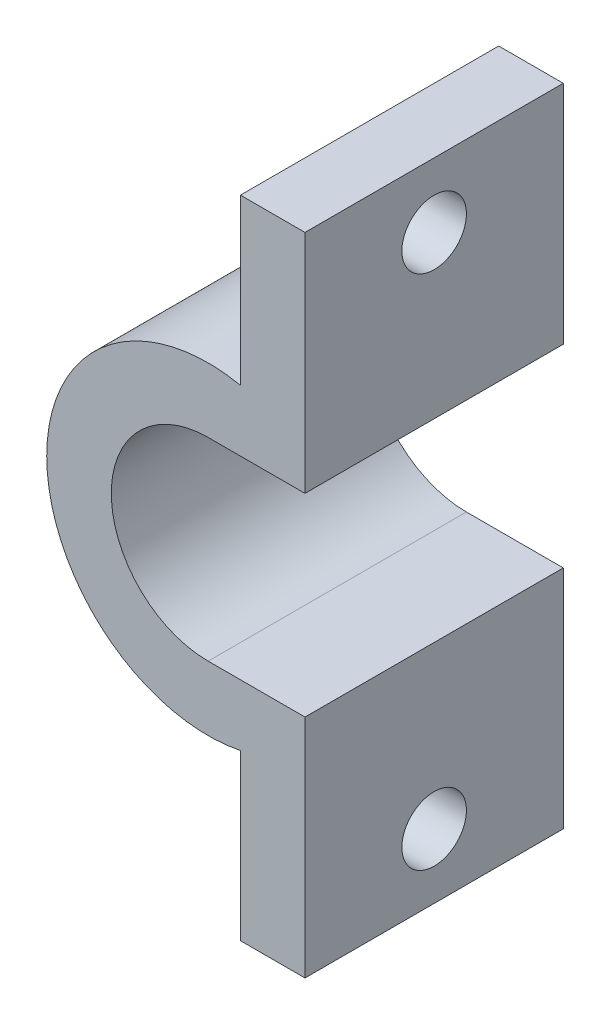
ISO-10303-21;
HEADER;
FILE_DESCRIPTION(('STEP AP214'),'2;1');
FILE_NAME('part.step','',(''),(''),'','','');
FILE_SCHEMA(('AUTOMOTIVE_DESIGN { 1 0 10303 214 1 1 1 1 }'));
ENDSEC;
DATA;
#1=APPLICATION_CONTEXT('core data for automotive mechanical design processes');
#2=APPLICATION_PROTOCOL_DEFINITION('international standard','automotive_design',2000,#1);
#3=PRODUCT_CONTEXT('',#1,'mechanical');
#4=PRODUCT('Part','Part','',(#3));
#5=PRODUCT_RELATED_PRODUCT_CATEGORY('part','',(#4));
#6=PRODUCT_DEFINITION_FORMATION('','',#4);
#7=PRODUCT_DEFINITION_CONTEXT('part definition',#1,'design');
#8=PRODUCT_DEFINITION('design','',#6,#7);
#9=PRODUCT_DEFINITION_SHAPE('','',#8);
#10=(LENGTH_UNIT() NAMED_UNIT(*) SI_UNIT(.MILLI.,.METRE.));
#11=(NAMED_UNIT(*) PLANE_ANGLE_UNIT() SI_UNIT($,.RADIAN.));
#12=(NAMED_UNIT(*) SI_UNIT($,.STERADIAN.) SOLID_ANGLE_UNIT());
#13=UNCERTAINTY_MEASURE_WITH_UNIT(LENGTH_MEASURE(1.E-05),#10,'distance_accuracy_value','');
#14=(GEOMETRIC_REPRESENTATION_CONTEXT(3) GLOBAL_UNCERTAINTY_ASSIGNED_CONTEXT((#13)) GLOBAL_UNIT_ASSIGNED_CONTEXT((#10,
#11,#12)) REPRESENTATION_CONTEXT('',''));
#15=CARTESIAN_POINT('',(0.,0.,0.));
#16=DIRECTION('',(0.,0.,1.));
#17=DIRECTION('',(1.,0.,0.));
#18=AXIS2_PLACEMENT_3D('',#15,#16,#17);
#19=CARTESIAN_POINT('',(-4.99999999999999,0.,20.));
#20=DIRECTION('',(-1.,0.,0.));
#21=DIRECTION('',(0.,-1.,0.));
#22=AXIS2_PLACEMENT_3D('',#19,#20,#21);
#23=PLANE('',#22);
#24=CARTESIAN_POINT('',(-4.99999999999999,20.,10.));
#25=DIRECTION('',(-1.,0.,0.));
#26=DIRECTION('',(0.,-1.,0.));
#27=AXIS2_PLACEMENT_3D('',#24,#25,#26);
#28=CIRCLE('',#27,2.5);
#29=CARTESIAN_POINT('',(-4.99999999999999,17.5,10.));
#30=VERTEX_POINT('',#29);
#31=EDGE_CURVE('E181',#30,#30,#28,.T.);
#32=ORIENTED_EDGE('',*,*,#31,.F.);
#33=EDGE_LOOP('',(#32));
#34=FACE_BOUND('',#33,.T.);
#35=DIRECTION('',(0.,1.,0.));
#36=VECTOR('',#35,1.);
#37=CARTESIAN_POINT('',(-4.99999999999999,0.,0.));
#38=LINE('',#37,#36);
#39=CARTESIAN_POINT('',(-4.99999999999999,12.2474487139159,0.));
#40=VERTEX_POINT('',#39);
#41=CARTESIAN_POINT('',(-5.,25.,0.));
#42=VERTEX_POINT('',#41);
#43=EDGE_CURVE('E142',#40,#42,#38,.T.);
#44=ORIENTED_EDGE('',*,*,#43,.F.);
#45=DIRECTION('',(0.,0.,-1.));
#46=VECTOR('',#45,1.);
#47=CARTESIAN_POINT('',(-4.99999999999999,12.2474487139159,20.));
#48=LINE('',#47,#46);
#49=CARTESIAN_POINT('',(-4.99999999999999,12.2474487139159,20.));
#50=VERTEX_POINT('',#49);
#51=EDGE_CURVE('E11',#50,#40,#48,.T.);
#52=ORIENTED_EDGE('',*,*,#51,.F.);
#53=DIRECTION('',(0.,1.,0.));
#54=VECTOR('',#53,1.);
#55=CARTESIAN_POINT('',(-4.99999999999999,0.,20.));
#56=LINE('',#55,#54);
#57=CARTESIAN_POINT('',(-5.,25.,20.));
#58=VERTEX_POINT('',#57);
#59=EDGE_CURVE('E166',#50,#58,#56,.T.);
#60=ORIENTED_EDGE('',*,*,#59,.T.);
#61=DIRECTION('',(0.,0.,-1.));
#62=VECTOR('',#61,1.);
#63=CARTESIAN_POINT('',(-5.,25.,20.));
#64=LINE('',#63,#62);
#65=EDGE_CURVE('E94',#58,#42,#64,.T.);
#66=ORIENTED_EDGE('',*,*,#65,.T.);
#67=EDGE_LOOP('',(#44,#52,#60,#66));
#68=FACE_BOUND('',#67,.T.);
#69=ADVANCED_FACE('F35',(#34,#68),#23,.T.);
#70=CARTESIAN_POINT('',(-7.49999999999999,0.,20.));
#71=DIRECTION('',(0.,0.,-1.));
#72=DIRECTION('',(-1.,0.,0.));
#73=AXIS2_PLACEMENT_3D('',#70,#71,#72);
#74=CYLINDRICAL_SURFACE('',#73,12.5);
#75=CARTESIAN_POINT('',(-7.49999999999999,0.,0.));
#76=DIRECTION('',(0.,0.,1.));
#77=DIRECTION('',(1.,0.,0.));
#78=AXIS2_PLACEMENT_3D('',#75,#76,#77);
#79=CIRCLE('',#78,12.5);
#80=CARTESIAN_POINT('',(-4.99999999999999,-12.2474487139159,0.));
#81=VERTEX_POINT('',#80);
#82=EDGE_CURVE('E145',#40,#81,#79,.T.);
#83=ORIENTED_EDGE('',*,*,#82,.T.);
#84=DIRECTION('',(0.,0.,-1.));
#85=VECTOR('',#84,1.);
#86=CARTESIAN_POINT('',(-4.99999999999999,-12.2474487139159,20.));
#87=LINE('',#86,#85);
#88=CARTESIAN_POINT('',(-4.99999999999999,-12.2474487139159,20.));
#89=VERTEX_POINT('',#88);
#90=EDGE_CURVE('E44',#89,#81,#87,.T.);
#91=ORIENTED_EDGE('',*,*,#90,.F.);
#92=CARTESIAN_POINT('',(-7.49999999999999,0.,20.));
#93=DIRECTION('',(0.,0.,1.));
#94=DIRECTION('',(1.,0.,0.));
#95=AXIS2_PLACEMENT_3D('',#92,#93,#94);
#96=CIRCLE('',#95,12.5);
#97=EDGE_CURVE('E194',#50,#89,#96,.T.);
#98=ORIENTED_EDGE('',*,*,#97,.F.);
#99=ORIENTED_EDGE('',*,*,#51,.T.);
#100=EDGE_LOOP('',(#83,#91,#98,#99));
#101=FACE_BOUND('',#100,.T.);
#102=ADVANCED_FACE('F218',(#101),#74,.T.);
#103=CARTESIAN_POINT('',(-4.99999999999999,0.,20.));
#104=DIRECTION('',(-1.,0.,0.));
#105=DIRECTION('',(0.,0.,1.));
#106=AXIS2_PLACEMENT_3D('',#103,#104,#105);
#107=PLANE('',#106);
#108=CARTESIAN_POINT('',(-4.99999999999998,-20.,10.));
#109=DIRECTION('',(-1.,0.,0.));
#110=DIRECTION('',(0.,-1.,0.));
#111=AXIS2_PLACEMENT_3D('',#108,#109,#110);
#112=CIRCLE('',#111,2.5);
#113=CARTESIAN_POINT('',(-4.99999999999998,-22.5,10.));
#114=VERTEX_POINT('',#113);
#115=EDGE_CURVE('E186',#114,#114,#112,.T.);
#116=ORIENTED_EDGE('',*,*,#115,.F.);
#117=EDGE_LOOP('',(#116));
#118=FACE_BOUND('',#117,.T.);
#119=DIRECTION('',(0.,1.,0.));
#120=VECTOR('',#119,1.);
#121=CARTESIAN_POINT('',(-4.99999999999999,0.,0.));
#122=LINE('',#121,#120);
#123=CARTESIAN_POINT('',(-4.99999999999999,-25.,0.));
#124=VERTEX_POINT('',#123);
#125=EDGE_CURVE('E148',#124,#81,#122,.T.);
#126=ORIENTED_EDGE('',*,*,#125,.F.);
#127=DIRECTION('',(0.,0.,-1.));
#128=VECTOR('',#127,1.);
#129=CARTESIAN_POINT('',(-4.99999999999999,-25.,20.));
#130=LINE('',#129,#128);
#131=CARTESIAN_POINT('',(-4.99999999999999,-25.,20.));
#132=VERTEX_POINT('',#131);
#133=EDGE_CURVE('E177',#132,#124,#130,.T.);
#134=ORIENTED_EDGE('',*,*,#133,.F.);
#135=DIRECTION('',(0.,1.,0.));
#136=VECTOR('',#135,1.);
#137=CARTESIAN_POINT('',(-4.99999999999999,0.,20.));
#138=LINE('',#137,#136);
#139=EDGE_CURVE('E196',#132,#89,#138,.T.);
#140=ORIENTED_EDGE('',*,*,#139,.T.);
#141=ORIENTED_EDGE('',*,*,#90,.T.);
#142=EDGE_LOOP('',(#126,#134,#140,#141));
#143=FACE_BOUND('',#142,.T.);
#144=ADVANCED_FACE('F221',(#118,#143),#107,.T.);
#145=CARTESIAN_POINT('',(0.,-25.,20.));
#146=DIRECTION('',(0.,1.,0.));
#147=DIRECTION('',(-1.,0.,0.));
#148=AXIS2_PLACEMENT_3D('',#145,#146,#147);
#149=PLANE('',#148);
#150=DIRECTION('',(1.,0.,0.));
#151=VECTOR('',#150,1.);
#152=CARTESIAN_POINT('',(0.,-25.,0.));
#153=LINE('',#152,#151);
#154=CARTESIAN_POINT('',(0.,-25.,0.));
#155=VERTEX_POINT('',#154);
#156=EDGE_CURVE('E151',#124,#155,#153,.T.);
#157=ORIENTED_EDGE('',*,*,#156,.T.);
#158=DIRECTION('',(0.,0.,-1.));
#159=VECTOR('',#158,1.);
#160=CARTESIAN_POINT('',(0.,-25.,20.));
#161=LINE('',#160,#159);
#162=CARTESIAN_POINT('',(0.,-25.,20.));
#163=VERTEX_POINT('',#162);
#164=EDGE_CURVE('E174',#163,#155,#161,.T.);
#165=ORIENTED_EDGE('',*,*,#164,.F.);
#166=DIRECTION('',(1.,0.,0.));
#167=VECTOR('',#166,1.);
#168=CARTESIAN_POINT('',(0.,-25.,20.));
#169=LINE('',#168,#167);
#170=EDGE_CURVE('E199',#132,#163,#169,.T.);
#171=ORIENTED_EDGE('',*,*,#170,.F.);
#172=ORIENTED_EDGE('',*,*,#133,.T.);
#173=EDGE_LOOP('',(#157,#165,#171,#172));
#174=FACE_BOUND('',#173,.T.);
#175=ADVANCED_FACE('F226',(#174),#149,.F.);
#176=CARTESIAN_POINT('',(0.,0.,20.));
#177=DIRECTION('',(-1.,0.,0.));
#178=DIRECTION('',(0.,-1.,0.));
#179=AXIS2_PLACEMENT_3D('',#176,#177,#178);
#180=PLANE('',#179);
#181=CARTESIAN_POINT('',(0.,-20.,10.));
#182=DIRECTION('',(-1.,0.,0.));
#183=DIRECTION('',(0.,-1.,0.));
#184=AXIS2_PLACEMENT_3D('',#181,#182,#183);
#185=CIRCLE('',#184,2.5);
#186=CARTESIAN_POINT('',(0.,-22.5,10.));
#187=VERTEX_POINT('',#186);
#188=EDGE_CURVE('E38',#187,#187,#185,.T.);
#189=ORIENTED_EDGE('',*,*,#188,.T.);
#190=EDGE_LOOP('',(#189));
#191=FACE_BOUND('',#190,.T.);
#192=DIRECTION('',(0.,1.,0.));
#193=VECTOR('',#192,1.);
#194=CARTESIAN_POINT('',(0.,0.,0.));
#195=LINE('',#194,#193);
#196=CARTESIAN_POINT('',(0.,-7.5,0.));
#197=VERTEX_POINT('',#196);
#198=EDGE_CURVE('E153',#155,#197,#195,.T.);
#199=ORIENTED_EDGE('',*,*,#198,.T.);
#200=DIRECTION('',(0.,0.,-1.));
#201=VECTOR('',#200,1.);
#202=CARTESIAN_POINT('',(0.,-7.5,20.));
#203=LINE('',#202,#201);
#204=CARTESIAN_POINT('',(0.,-7.5,20.));
#205=VERTEX_POINT('',#204);
#206=EDGE_CURVE('E172',#205,#197,#203,.T.);
#207=ORIENTED_EDGE('',*,*,#206,.F.);
#208=DIRECTION('',(0.,1.,0.));
#209=VECTOR('',#208,1.);
#210=CARTESIAN_POINT('',(0.,0.,20.));
#211=LINE('',#210,#209);
#212=EDGE_CURVE('E201',#163,#205,#211,.T.);
#213=ORIENTED_EDGE('',*,*,#212,.F.);
#214=ORIENTED_EDGE('',*,*,#164,.T.);
#215=EDGE_LOOP('',(#199,#207,#213,#214));
#216=FACE_BOUND('',#215,.T.);
#217=ADVANCED_FACE('F230',(#191,#216),#180,.F.);
#218=CARTESIAN_POINT('',(0.,-7.5,20.));
#219=DIRECTION('',(0.,1.,0.));
#220=DIRECTION('',(-1.,0.,0.));
#221=AXIS2_PLACEMENT_3D('',#218,#219,#220);
#222=PLANE('',#221);
#223=DIRECTION('',(1.,0.,0.));
#224=VECTOR('',#223,1.);
#225=CARTESIAN_POINT('',(0.,-7.5,0.));
#226=LINE('',#225,#224);
#227=CARTESIAN_POINT('',(-7.49999999999999,-7.5,0.));
#228=VERTEX_POINT('',#227);
#229=EDGE_CURVE('E156',#228,#197,#226,.T.);
#230=ORIENTED_EDGE('',*,*,#229,.F.);
#231=DIRECTION('',(0.,0.,-1.));
#232=VECTOR('',#231,1.);
#233=CARTESIAN_POINT('',(-7.49999999999999,-7.5,20.));
#234=LINE('',#233,#232);
#235=CARTESIAN_POINT('',(-7.49999999999999,-7.5,20.));
#236=VERTEX_POINT('',#235);
#237=EDGE_CURVE('E170',#236,#228,#234,.T.);
#238=ORIENTED_EDGE('',*,*,#237,.F.);
#239=DIRECTION('',(1.,0.,0.));
#240=VECTOR('',#239,1.);
#241=CARTESIAN_POINT('',(0.,-7.5,20.));
#242=LINE('',#241,#240);
#243=EDGE_CURVE('E203',#236,#205,#242,.T.);
#244=ORIENTED_EDGE('',*,*,#243,.T.);
#245=ORIENTED_EDGE('',*,*,#206,.T.);
#246=EDGE_LOOP('',(#230,#238,#244,#245));
#247=FACE_BOUND('',#246,.T.);
#248=ADVANCED_FACE('F233',(#247),#222,.T.);
#249=CARTESIAN_POINT('',(-7.49999999999999,0.,20.));
#250=DIRECTION('',(0.,0.,-1.));
#251=DIRECTION('',(-1.,0.,0.));
#252=AXIS2_PLACEMENT_3D('',#249,#250,#251);
#253=CYLINDRICAL_SURFACE('',#252,7.5);
#254=CARTESIAN_POINT('',(-7.49999999999999,0.,0.));
#255=DIRECTION('',(0.,0.,1.));
#256=DIRECTION('',(1.,0.,0.));
#257=AXIS2_PLACEMENT_3D('',#254,#255,#256);
#258=CIRCLE('',#257,7.5);
#259=CARTESIAN_POINT('',(-7.49999999999999,7.5,0.));
#260=VERTEX_POINT('',#259);
#261=EDGE_CURVE('E159',#260,#228,#258,.T.);
#262=ORIENTED_EDGE('',*,*,#261,.F.);
#263=DIRECTION('',(0.,0.,-1.));
#264=VECTOR('',#263,1.);
#265=CARTESIAN_POINT('',(-7.49999999999999,7.5,20.));
#266=LINE('',#265,#264);
#267=CARTESIAN_POINT('',(-7.49999999999999,7.5,20.));
#268=VERTEX_POINT('',#267);
#269=EDGE_CURVE('E134',#268,#260,#266,.T.);
#270=ORIENTED_EDGE('',*,*,#269,.F.);
#271=CARTESIAN_POINT('',(-7.49999999999999,0.,20.));
#272=DIRECTION('',(0.,0.,1.));
#273=DIRECTION('',(1.,0.,0.));
#274=AXIS2_PLACEMENT_3D('',#271,#272,#273);
#275=CIRCLE('',#274,7.5);
#276=EDGE_CURVE('E127',#268,#236,#275,.T.);
#277=ORIENTED_EDGE('',*,*,#276,.T.);
#278=ORIENTED_EDGE('',*,*,#237,.T.);
#279=EDGE_LOOP('',(#262,#270,#277,#278));
#280=FACE_BOUND('',#279,.T.);
#281=ADVANCED_FACE('F207',(#280),#253,.F.);
#282=CARTESIAN_POINT('',(0.,7.5,20.));
#283=DIRECTION('',(0.,1.,0.));
#284=DIRECTION('',(-1.,0.,0.));
#285=AXIS2_PLACEMENT_3D('',#282,#283,#284);
#286=PLANE('',#285);
#287=DIRECTION('',(1.,0.,0.));
#288=VECTOR('',#287,1.);
#289=CARTESIAN_POINT('',(0.,7.5,0.));
#290=LINE('',#289,#288);
#291=CARTESIAN_POINT('',(0.,7.5,0.));
#292=VERTEX_POINT('',#291);
#293=EDGE_CURVE('E133',#260,#292,#290,.T.);
#294=ORIENTED_EDGE('',*,*,#293,.T.);
#295=DIRECTION('',(0.,0.,-1.));
#296=VECTOR('',#295,1.);
#297=CARTESIAN_POINT('',(0.,7.5,20.));
#298=LINE('',#297,#296);
#299=CARTESIAN_POINT('',(0.,7.5,20.));
#300=VERTEX_POINT('',#299);
#301=EDGE_CURVE('E130',#300,#292,#298,.T.);
#302=ORIENTED_EDGE('',*,*,#301,.F.);
#303=DIRECTION('',(1.,0.,0.));
#304=VECTOR('',#303,1.);
#305=CARTESIAN_POINT('',(0.,7.5,20.));
#306=LINE('',#305,#304);
#307=EDGE_CURVE('E120',#268,#300,#306,.T.);
#308=ORIENTED_EDGE('',*,*,#307,.F.);
#309=ORIENTED_EDGE('',*,*,#269,.T.);
#310=EDGE_LOOP('',(#294,#302,#308,#309));
#311=FACE_BOUND('',#310,.T.);
#312=ADVANCED_FACE('F131',(#311),#286,.F.);
#313=CARTESIAN_POINT('',(0.,0.,20.));
#314=DIRECTION('',(-1.,0.,0.));
#315=DIRECTION('',(0.,-1.,0.));
#316=AXIS2_PLACEMENT_3D('',#313,#314,#315);
#317=PLANE('',#316);
#318=CARTESIAN_POINT('',(0.,20.,10.));
#319=DIRECTION('',(-1.,0.,0.));
#320=DIRECTION('',(0.,-1.,0.));
#321=AXIS2_PLACEMENT_3D('',#318,#319,#320);
#322=CIRCLE('',#321,2.5);
#323=CARTESIAN_POINT('',(0.,17.5,10.));
#324=VERTEX_POINT('',#323);
#325=EDGE_CURVE('E179',#324,#324,#322,.T.);
#326=ORIENTED_EDGE('',*,*,#325,.T.);
#327=EDGE_LOOP('',(#326));
#328=FACE_BOUND('',#327,.T.);
#329=DIRECTION('',(0.,1.,0.));
#330=VECTOR('',#329,1.);
#331=CARTESIAN_POINT('',(0.,0.,0.));
#332=LINE('',#331,#330);
#333=CARTESIAN_POINT('',(0.,25.,0.));
#334=VERTEX_POINT('',#333);
#335=EDGE_CURVE('E87',#292,#334,#332,.T.);
#336=ORIENTED_EDGE('',*,*,#335,.T.);
#337=DIRECTION('',(0.,0.,-1.));
#338=VECTOR('',#337,1.);
#339=CARTESIAN_POINT('',(0.,25.,20.));
#340=LINE('',#339,#338);
#341=CARTESIAN_POINT('',(0.,25.,20.));
#342=VERTEX_POINT('',#341);
#343=EDGE_CURVE('E135',#342,#334,#340,.T.);
#344=ORIENTED_EDGE('',*,*,#343,.F.);
#345=DIRECTION('',(0.,1.,0.));
#346=VECTOR('',#345,1.);
#347=CARTESIAN_POINT('',(0.,0.,20.));
#348=LINE('',#347,#346);
#349=EDGE_CURVE('E124',#300,#342,#348,.T.);
#350=ORIENTED_EDGE('',*,*,#349,.F.);
#351=ORIENTED_EDGE('',*,*,#301,.T.);
#352=EDGE_LOOP('',(#336,#344,#350,#351));
#353=FACE_BOUND('',#352,.T.);
#354=ADVANCED_FACE('F137',(#328,#353),#317,.F.);
#355=CARTESIAN_POINT('',(0.,25.,20.));
#356=DIRECTION('',(0.,-1.,0.));
#357=DIRECTION('',(0.,0.,-1.));
#358=AXIS2_PLACEMENT_3D('',#355,#356,#357);
#359=PLANE('',#358);
#360=DIRECTION('',(-1.,0.,0.));
#361=VECTOR('',#360,1.);
#362=CARTESIAN_POINT('',(0.,25.,0.));
#363=LINE('',#362,#361);
#364=EDGE_CURVE('E164',#334,#42,#363,.T.);
#365=ORIENTED_EDGE('',*,*,#364,.T.);
#366=ORIENTED_EDGE('',*,*,#65,.F.);
#367=DIRECTION('',(-1.,0.,0.));
#368=VECTOR('',#367,1.);
#369=CARTESIAN_POINT('',(0.,25.,20.));
#370=LINE('',#369,#368);
#371=EDGE_CURVE('E53',#342,#58,#370,.T.);
#372=ORIENTED_EDGE('',*,*,#371,.F.);
#373=ORIENTED_EDGE('',*,*,#343,.T.);
#374=EDGE_LOOP('',(#365,#366,#372,#373));
#375=FACE_BOUND('',#374,.T.);
#376=ADVANCED_FACE('F214',(#375),#359,.F.);
#377=CARTESIAN_POINT('',(0.,0.,20.));
#378=DIRECTION('',(0.,0.,1.));
#379=DIRECTION('',(1.,0.,0.));
#380=AXIS2_PLACEMENT_3D('',#377,#378,#379);
#381=PLANE('',#380);
#382=ORIENTED_EDGE('',*,*,#59,.F.);
#383=ORIENTED_EDGE('',*,*,#97,.T.);
#384=ORIENTED_EDGE('',*,*,#139,.F.);
#385=ORIENTED_EDGE('',*,*,#170,.T.);
#386=ORIENTED_EDGE('',*,*,#212,.T.);
#387=ORIENTED_EDGE('',*,*,#243,.F.);
#388=ORIENTED_EDGE('',*,*,#276,.F.);
#389=ORIENTED_EDGE('',*,*,#307,.T.);
#390=ORIENTED_EDGE('',*,*,#349,.T.);
#391=ORIENTED_EDGE('',*,*,#371,.T.);
#392=EDGE_LOOP('',(#382,#383,#384,#385,#386,#387,#388,#389,#390,#391));
#393=FACE_BOUND('',#392,.T.);
#394=ADVANCED_FACE('F122',(#393),#381,.T.);
#395=CARTESIAN_POINT('',(0.,0.,0.));
#396=DIRECTION('',(0.,0.,1.));
#397=DIRECTION('',(1.,0.,0.));
#398=AXIS2_PLACEMENT_3D('',#395,#396,#397);
#399=PLANE('',#398);
#400=ORIENTED_EDGE('',*,*,#43,.T.);
#401=ORIENTED_EDGE('',*,*,#364,.F.);
#402=ORIENTED_EDGE('',*,*,#335,.F.);
#403=ORIENTED_EDGE('',*,*,#293,.F.);
#404=ORIENTED_EDGE('',*,*,#261,.T.);
#405=ORIENTED_EDGE('',*,*,#229,.T.);
#406=ORIENTED_EDGE('',*,*,#198,.F.);
#407=ORIENTED_EDGE('',*,*,#156,.F.);
#408=ORIENTED_EDGE('',*,*,#125,.T.);
#409=ORIENTED_EDGE('',*,*,#82,.F.);
#410=EDGE_LOOP('',(#400,#401,#402,#403,#404,#405,#406,#407,#408,#409));
#411=FACE_BOUND('',#410,.T.);
#412=ADVANCED_FACE('F210',(#411),#399,.F.);
#413=CARTESIAN_POINT('',(10.,20.,10.));
#414=DIRECTION('',(-1.,0.,0.));
#415=DIRECTION('',(0.,-1.,0.));
#416=AXIS2_PLACEMENT_3D('',#413,#414,#415);
#417=CYLINDRICAL_SURFACE('',#416,2.5);
#418=ORIENTED_EDGE('',*,*,#31,.T.);
#419=EDGE_LOOP('',(#418));
#420=FACE_BOUND('',#419,.T.);
#421=ORIENTED_EDGE('',*,*,#325,.F.);
#422=EDGE_LOOP('',(#421));
#423=FACE_BOUND('',#422,.T.);
#424=ADVANCED_FACE('F283',(#420,#423),#417,.F.);
#425=CARTESIAN_POINT('',(10.,-20.,10.));
#426=DIRECTION('',(-1.,0.,0.));
#427=DIRECTION('',(0.,-1.,0.));
#428=AXIS2_PLACEMENT_3D('',#425,#426,#427);
#429=CYLINDRICAL_SURFACE('',#428,2.5);
#430=ORIENTED_EDGE('',*,*,#115,.T.);
#431=EDGE_LOOP('',(#430));
#432=FACE_BOUND('',#431,.T.);
#433=ORIENTED_EDGE('',*,*,#188,.F.);
#434=EDGE_LOOP('',(#433));
#435=FACE_BOUND('',#434,.T.);
#436=ADVANCED_FACE('F288',(#432,#435),#429,.F.);
#437=CLOSED_SHELL('',(#69,#102,#144,#175,#217,#248,#281,#312,#354,#376,#394,#412,#424,#436));
#438=MANIFOLD_SOLID_BREP('B2',#437);
#439=ADVANCED_BREP_SHAPE_REPRESENTATION('',(#18,#438),#14);
#440=SHAPE_DEFINITION_REPRESENTATION(#9,#439);
ENDSEC;
END-ISO-10303-21;
